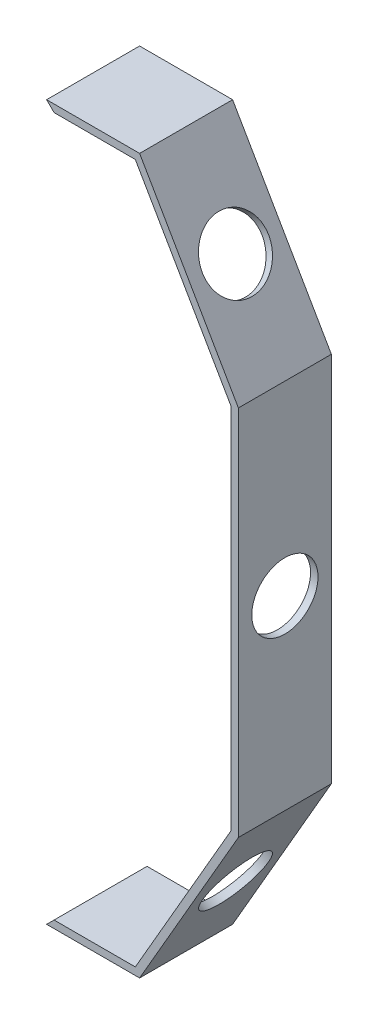
ISO-10303-21;
HEADER;
FILE_DESCRIPTION(('STEP AP214'),'2;1');
FILE_NAME('part.step','',(''),(''),'','','');
FILE_SCHEMA(('AUTOMOTIVE_DESIGN { 1 0 10303 214 1 1 1 1 }'));
ENDSEC;
DATA;
#1=APPLICATION_CONTEXT('core data for automotive mechanical design processes');
#2=APPLICATION_PROTOCOL_DEFINITION('international standard','automotive_design',2000,#1);
#3=PRODUCT_CONTEXT('',#1,'mechanical');
#4=PRODUCT('Part','Part','',(#3));
#5=PRODUCT_RELATED_PRODUCT_CATEGORY('part','',(#4));
#6=PRODUCT_DEFINITION_FORMATION('','',#4);
#7=PRODUCT_DEFINITION_CONTEXT('part definition',#1,'design');
#8=PRODUCT_DEFINITION('design','',#6,#7);
#9=PRODUCT_DEFINITION_SHAPE('','',#8);
#10=(LENGTH_UNIT() NAMED_UNIT(*) SI_UNIT(.MILLI.,.METRE.));
#11=(NAMED_UNIT(*) PLANE_ANGLE_UNIT() SI_UNIT($,.RADIAN.));
#12=(NAMED_UNIT(*) SI_UNIT($,.STERADIAN.) SOLID_ANGLE_UNIT());
#13=UNCERTAINTY_MEASURE_WITH_UNIT(LENGTH_MEASURE(1.E-05),#10,'distance_accuracy_value','');
#14=(GEOMETRIC_REPRESENTATION_CONTEXT(3) GLOBAL_UNCERTAINTY_ASSIGNED_CONTEXT((#13)) GLOBAL_UNIT_ASSIGNED_CONTEXT((#10,
#11,#12)) REPRESENTATION_CONTEXT('',''));
#15=CARTESIAN_POINT('',(0.,0.,0.));
#16=DIRECTION('',(0.,0.,1.));
#17=DIRECTION('',(1.,0.,0.));
#18=AXIS2_PLACEMENT_3D('',#15,#16,#17);
#19=CARTESIAN_POINT('',(-12.5,96.,25.));
#20=DIRECTION('',(0.,-1.,0.));
#21=DIRECTION('',(0.,0.,-1.));
#22=AXIS2_PLACEMENT_3D('',#19,#20,#21);
#23=PLANE('',#22);
#24=DIRECTION('',(-1.,0.,0.));
#25=VECTOR('',#24,1.);
#26=CARTESIAN_POINT('',(-12.5,96.,0.));
#27=LINE('',#26,#25);
#28=CARTESIAN_POINT('',(12.5,96.,0.));
#29=VERTEX_POINT('',#28);
#30=CARTESIAN_POINT('',(-12.5,96.,0.));
#31=VERTEX_POINT('',#30);
#32=EDGE_CURVE('E156',#29,#31,#27,.T.);
#33=ORIENTED_EDGE('',*,*,#32,.T.);
#34=DIRECTION('',(0.,0.,-1.));
#35=VECTOR('',#34,1.);
#36=CARTESIAN_POINT('',(-12.5,96.,25.));
#37=LINE('',#36,#35);
#38=CARTESIAN_POINT('',(-12.5,96.,25.));
#39=VERTEX_POINT('',#38);
#40=EDGE_CURVE('E11',#39,#31,#37,.T.);
#41=ORIENTED_EDGE('',*,*,#40,.F.);
#42=DIRECTION('',(-1.,0.,0.));
#43=VECTOR('',#42,1.);
#44=CARTESIAN_POINT('',(-12.5,96.,25.));
#45=LINE('',#44,#43);
#46=CARTESIAN_POINT('',(12.5,96.,25.));
#47=VERTEX_POINT('',#46);
#48=EDGE_CURVE('E179',#47,#39,#45,.T.);
#49=ORIENTED_EDGE('',*,*,#48,.F.);
#50=DIRECTION('',(0.,0.,-1.));
#51=VECTOR('',#50,1.);
#52=CARTESIAN_POINT('',(12.5,96.,25.));
#53=LINE('',#52,#51);
#54=EDGE_CURVE('E152',#47,#29,#53,.T.);
#55=ORIENTED_EDGE('',*,*,#54,.T.);
#56=EDGE_LOOP('',(#33,#41,#49,#55));
#57=FACE_BOUND('',#56,.T.);
#58=ADVANCED_FACE('F36',(#57),#23,.F.);
#59=CARTESIAN_POINT('',(-12.5,96.,25.));
#60=DIRECTION('',(0.707106781186548,0.707106781186547,0.));
#61=DIRECTION('',(-0.707106781186547,0.707106781186548,0.));
#62=AXIS2_PLACEMENT_3D('',#59,#60,#61);
#63=PLANE('',#62);
#64=DIRECTION('',(0.707106781186547,-0.707106781186548,0.));
#65=VECTOR('',#64,1.);
#66=CARTESIAN_POINT('',(-12.5,96.,0.));
#67=LINE('',#66,#65);
#68=CARTESIAN_POINT('',(-10.5,94.,0.));
#69=VERTEX_POINT('',#68);
#70=EDGE_CURVE('E159',#31,#69,#67,.T.);
#71=ORIENTED_EDGE('',*,*,#70,.T.);
#72=DIRECTION('',(0.,0.,-1.));
#73=VECTOR('',#72,1.);
#74=CARTESIAN_POINT('',(-10.5,94.,25.));
#75=LINE('',#74,#73);
#76=CARTESIAN_POINT('',(-10.5,94.,25.));
#77=VERTEX_POINT('',#76);
#78=EDGE_CURVE('E44',#77,#69,#75,.T.);
#79=ORIENTED_EDGE('',*,*,#78,.F.);
#80=DIRECTION('',(0.707106781186547,-0.707106781186548,0.));
#81=VECTOR('',#80,1.);
#82=CARTESIAN_POINT('',(-12.5,96.,25.));
#83=LINE('',#82,#81);
#84=EDGE_CURVE('E107',#39,#77,#83,.T.);
#85=ORIENTED_EDGE('',*,*,#84,.F.);
#86=ORIENTED_EDGE('',*,*,#40,.T.);
#87=EDGE_LOOP('',(#71,#79,#85,#86));
#88=FACE_BOUND('',#87,.T.);
#89=ADVANCED_FACE('F260',(#88),#63,.F.);
#90=CARTESIAN_POINT('',(-10.5,94.,25.));
#91=DIRECTION('',(0.,1.,0.));
#92=DIRECTION('',(0.,0.,1.));
#93=AXIS2_PLACEMENT_3D('',#90,#91,#92);
#94=PLANE('',#93);
#95=DIRECTION('',(1.,0.,0.));
#96=VECTOR('',#95,1.);
#97=CARTESIAN_POINT('',(-10.5,94.,0.));
#98=LINE('',#97,#96);
#99=CARTESIAN_POINT('',(11.3452994616208,94.,0.));
#100=VERTEX_POINT('',#99);
#101=EDGE_CURVE('E162',#69,#100,#98,.T.);
#102=ORIENTED_EDGE('',*,*,#101,.T.);
#103=DIRECTION('',(0.,0.,-1.));
#104=VECTOR('',#103,1.);
#105=CARTESIAN_POINT('',(11.3452994616208,94.,25.));
#106=LINE('',#105,#104);
#107=CARTESIAN_POINT('',(11.3452994616208,94.,25.));
#108=VERTEX_POINT('',#107);
#109=EDGE_CURVE('E198',#108,#100,#106,.T.);
#110=ORIENTED_EDGE('',*,*,#109,.F.);
#111=DIRECTION('',(1.,0.,0.));
#112=VECTOR('',#111,1.);
#113=CARTESIAN_POINT('',(-10.5,94.,25.));
#114=LINE('',#113,#112);
#115=EDGE_CURVE('E206',#77,#108,#114,.T.);
#116=ORIENTED_EDGE('',*,*,#115,.F.);
#117=ORIENTED_EDGE('',*,*,#78,.T.);
#118=EDGE_LOOP('',(#102,#110,#116,#117));
#119=FACE_BOUND('',#118,.T.);
#120=ADVANCED_FACE('F204',(#119),#94,.F.);
#121=CARTESIAN_POINT('',(11.3452994616208,94.,25.));
#122=DIRECTION('',(0.866025403784435,0.500000000000007,0.));
#123=DIRECTION('',(-0.500000000000007,0.866025403784435,0.));
#124=AXIS2_PLACEMENT_3D('',#121,#122,#123);
#125=PLANE('',#124);
#126=CARTESIAN_POINT('',(24.0470053837928,72.,12.5));
#127=DIRECTION('',(0.866025403784435,0.500000000000007,0.));
#128=DIRECTION('',(-0.500000000000007,0.866025403784435,0.));
#129=AXIS2_PLACEMENT_3D('',#126,#127,#128);
#130=CIRCLE('',#129,8.9);
#131=CARTESIAN_POINT('',(19.5970053837927,79.7076260936815,12.5));
#132=VERTEX_POINT('',#131);
#133=EDGE_CURVE('E303',#132,#132,#130,.T.);
#134=ORIENTED_EDGE('',*,*,#133,.T.);
#135=EDGE_LOOP('',(#134));
#136=FACE_BOUND('',#135,.T.);
#137=DIRECTION('',(0.500000000000007,-0.866025403784435,0.));
#138=VECTOR('',#137,1.);
#139=CARTESIAN_POINT('',(11.3452994616208,94.,0.));
#140=LINE('',#139,#138);
#141=CARTESIAN_POINT('',(37.0581123827233,49.4641016151377,0.));
#142=VERTEX_POINT('',#141);
#143=EDGE_CURVE('E164',#100,#142,#140,.T.);
#144=ORIENTED_EDGE('',*,*,#143,.T.);
#145=DIRECTION('',(0.,0.,-1.));
#146=VECTOR('',#145,1.);
#147=CARTESIAN_POINT('',(37.0581123827233,49.4641016151377,25.));
#148=LINE('',#147,#146);
#149=CARTESIAN_POINT('',(37.0581123827233,49.4641016151377,25.));
#150=VERTEX_POINT('',#149);
#151=EDGE_CURVE('E195',#150,#142,#148,.T.);
#152=ORIENTED_EDGE('',*,*,#151,.F.);
#153=DIRECTION('',(0.500000000000007,-0.866025403784435,0.));
#154=VECTOR('',#153,1.);
#155=CARTESIAN_POINT('',(11.3452994616208,94.,25.));
#156=LINE('',#155,#154);
#157=EDGE_CURVE('E224',#108,#150,#156,.T.);
#158=ORIENTED_EDGE('',*,*,#157,.F.);
#159=ORIENTED_EDGE('',*,*,#109,.T.);
#160=EDGE_LOOP('',(#144,#152,#158,#159));
#161=FACE_BOUND('',#160,.T.);
#162=ADVANCED_FACE('F215',(#136,#161),#125,.F.);
#163=CARTESIAN_POINT('',(37.0581123827233,-49.4641016151378,25.));
#164=DIRECTION('',(1.,0.,0.));
#165=DIRECTION('',(0.,0.,-1.));
#166=AXIS2_PLACEMENT_3D('',#163,#164,#165);
#167=PLANE('',#166);
#168=CARTESIAN_POINT('',(37.0581123827233,0.,12.5));
#169=DIRECTION('',(1.,0.,0.));
#170=DIRECTION('',(0.,0.,-1.));
#171=AXIS2_PLACEMENT_3D('',#168,#169,#170);
#172=CIRCLE('',#171,8.9);
#173=CARTESIAN_POINT('',(37.0581123827233,0.,3.6));
#174=VERTEX_POINT('',#173);
#175=EDGE_CURVE('E160',#174,#174,#172,.T.);
#176=ORIENTED_EDGE('',*,*,#175,.T.);
#177=EDGE_LOOP('',(#176));
#178=FACE_BOUND('',#177,.T.);
#179=DIRECTION('',(0.,-1.,0.));
#180=VECTOR('',#179,1.);
#181=CARTESIAN_POINT('',(37.0581123827233,-49.4641016151378,0.));
#182=LINE('',#181,#180);
#183=CARTESIAN_POINT('',(37.0581123827233,-49.4641016151378,0.));
#184=VERTEX_POINT('',#183);
#185=EDGE_CURVE('E166',#142,#184,#182,.T.);
#186=ORIENTED_EDGE('',*,*,#185,.T.);
#187=DIRECTION('',(0.,0.,-1.));
#188=VECTOR('',#187,1.);
#189=CARTESIAN_POINT('',(37.0581123827233,-49.4641016151378,25.));
#190=LINE('',#189,#188);
#191=CARTESIAN_POINT('',(37.0581123827233,-49.4641016151378,25.));
#192=VERTEX_POINT('',#191);
#193=EDGE_CURVE('E192',#192,#184,#190,.T.);
#194=ORIENTED_EDGE('',*,*,#193,.F.);
#195=DIRECTION('',(0.,-1.,0.));
#196=VECTOR('',#195,1.);
#197=CARTESIAN_POINT('',(37.0581123827233,-49.4641016151378,25.));
#198=LINE('',#197,#196);
#199=EDGE_CURVE('E221',#150,#192,#198,.T.);
#200=ORIENTED_EDGE('',*,*,#199,.F.);
#201=ORIENTED_EDGE('',*,*,#151,.T.);
#202=EDGE_LOOP('',(#186,#194,#200,#201));
#203=FACE_BOUND('',#202,.T.);
#204=ADVANCED_FACE('F219',(#178,#203),#167,.F.);
#205=CARTESIAN_POINT('',(37.0581123827233,-49.4641016151378,25.));
#206=DIRECTION('',(0.866025403784435,-0.500000000000007,0.));
#207=DIRECTION('',(0.500000000000007,0.866025403784435,0.));
#208=AXIS2_PLACEMENT_3D('',#205,#206,#207);
#209=PLANE('',#208);
#210=CARTESIAN_POINT('',(24.0470053837928,-72.,12.5));
#211=DIRECTION('',(0.866025403784435,-0.500000000000007,0.));
#212=DIRECTION('',(0.500000000000007,0.866025403784435,0.));
#213=AXIS2_PLACEMENT_3D('',#210,#211,#212);
#214=CIRCLE('',#213,8.9);
#215=CARTESIAN_POINT('',(28.4970053837928,-64.2923739063185,12.5));
#216=VERTEX_POINT('',#215);
#217=EDGE_CURVE('E295',#216,#216,#214,.T.);
#218=ORIENTED_EDGE('',*,*,#217,.T.);
#219=EDGE_LOOP('',(#218));
#220=FACE_BOUND('',#219,.T.);
#221=DIRECTION('',(-0.500000000000007,-0.866025403784435,0.));
#222=VECTOR('',#221,1.);
#223=CARTESIAN_POINT('',(37.0581123827233,-49.4641016151378,0.));
#224=LINE('',#223,#222);
#225=CARTESIAN_POINT('',(11.3452994616208,-94.,0.));
#226=VERTEX_POINT('',#225);
#227=EDGE_CURVE('E168',#184,#226,#224,.T.);
#228=ORIENTED_EDGE('',*,*,#227,.T.);
#229=DIRECTION('',(0.,0.,-1.));
#230=VECTOR('',#229,1.);
#231=CARTESIAN_POINT('',(11.3452994616208,-94.,25.));
#232=LINE('',#231,#230);
#233=CARTESIAN_POINT('',(11.3452994616208,-94.,25.));
#234=VERTEX_POINT('',#233);
#235=EDGE_CURVE('E189',#234,#226,#232,.T.);
#236=ORIENTED_EDGE('',*,*,#235,.F.);
#237=DIRECTION('',(-0.500000000000007,-0.866025403784435,0.));
#238=VECTOR('',#237,1.);
#239=CARTESIAN_POINT('',(37.0581123827233,-49.4641016151378,25.));
#240=LINE('',#239,#238);
#241=EDGE_CURVE('E223',#192,#234,#240,.T.);
#242=ORIENTED_EDGE('',*,*,#241,.F.);
#243=ORIENTED_EDGE('',*,*,#193,.T.);
#244=EDGE_LOOP('',(#228,#236,#242,#243));
#245=FACE_BOUND('',#244,.T.);
#246=ADVANCED_FACE('F274',(#220,#245),#209,.F.);
#247=CARTESIAN_POINT('',(-10.5,-94.,25.));
#248=DIRECTION('',(0.,-1.,0.));
#249=DIRECTION('',(0.,0.,-1.));
#250=AXIS2_PLACEMENT_3D('',#247,#248,#249);
#251=PLANE('',#250);
#252=DIRECTION('',(-1.,0.,0.));
#253=VECTOR('',#252,1.);
#254=CARTESIAN_POINT('',(-10.5,-94.,0.));
#255=LINE('',#254,#253);
#256=CARTESIAN_POINT('',(-10.5,-94.,0.));
#257=VERTEX_POINT('',#256);
#258=EDGE_CURVE('E170',#226,#257,#255,.T.);
#259=ORIENTED_EDGE('',*,*,#258,.T.);
#260=DIRECTION('',(0.,0.,-1.));
#261=VECTOR('',#260,1.);
#262=CARTESIAN_POINT('',(-10.5,-94.,25.));
#263=LINE('',#262,#261);
#264=CARTESIAN_POINT('',(-10.5,-94.,25.));
#265=VERTEX_POINT('',#264);
#266=EDGE_CURVE('E186',#265,#257,#263,.T.);
#267=ORIENTED_EDGE('',*,*,#266,.F.);
#268=DIRECTION('',(-1.,0.,0.));
#269=VECTOR('',#268,1.);
#270=CARTESIAN_POINT('',(-10.5,-94.,25.));
#271=LINE('',#270,#269);
#272=EDGE_CURVE('E226',#234,#265,#271,.T.);
#273=ORIENTED_EDGE('',*,*,#272,.F.);
#274=ORIENTED_EDGE('',*,*,#235,.T.);
#275=EDGE_LOOP('',(#259,#267,#273,#274));
#276=FACE_BOUND('',#275,.T.);
#277=ADVANCED_FACE('F278',(#276),#251,.F.);
#278=CARTESIAN_POINT('',(-10.5,-94.,25.));
#279=DIRECTION('',(0.707106781186548,-0.707106781186547,0.));
#280=DIRECTION('',(0.707106781186547,0.707106781186548,0.));
#281=AXIS2_PLACEMENT_3D('',#278,#279,#280);
#282=PLANE('',#281);
#283=DIRECTION('',(-0.707106781186547,-0.707106781186548,0.));
#284=VECTOR('',#283,1.);
#285=CARTESIAN_POINT('',(-10.5,-94.,0.));
#286=LINE('',#285,#284);
#287=CARTESIAN_POINT('',(-12.5,-96.,0.));
#288=VERTEX_POINT('',#287);
#289=EDGE_CURVE('E172',#257,#288,#286,.T.);
#290=ORIENTED_EDGE('',*,*,#289,.T.);
#291=DIRECTION('',(0.,0.,-1.));
#292=VECTOR('',#291,1.);
#293=CARTESIAN_POINT('',(-12.5,-96.,25.));
#294=LINE('',#293,#292);
#295=CARTESIAN_POINT('',(-12.5,-96.,25.));
#296=VERTEX_POINT('',#295);
#297=EDGE_CURVE('E183',#296,#288,#294,.T.);
#298=ORIENTED_EDGE('',*,*,#297,.F.);
#299=DIRECTION('',(-0.707106781186547,-0.707106781186548,0.));
#300=VECTOR('',#299,1.);
#301=CARTESIAN_POINT('',(-10.5,-94.,25.));
#302=LINE('',#301,#300);
#303=EDGE_CURVE('E232',#265,#296,#302,.T.);
#304=ORIENTED_EDGE('',*,*,#303,.F.);
#305=ORIENTED_EDGE('',*,*,#266,.T.);
#306=EDGE_LOOP('',(#290,#298,#304,#305));
#307=FACE_BOUND('',#306,.T.);
#308=ADVANCED_FACE('F238',(#307),#282,.F.);
#309=CARTESIAN_POINT('',(-12.5,-96.,25.));
#310=DIRECTION('',(0.,1.,0.));
#311=DIRECTION('',(0.,0.,1.));
#312=AXIS2_PLACEMENT_3D('',#309,#310,#311);
#313=PLANE('',#312);
#314=DIRECTION('',(1.,0.,0.));
#315=VECTOR('',#314,1.);
#316=CARTESIAN_POINT('',(-12.5,-96.,0.));
#317=LINE('',#316,#315);
#318=CARTESIAN_POINT('',(12.5,-96.,0.));
#319=VERTEX_POINT('',#318);
#320=EDGE_CURVE('E174',#288,#319,#317,.T.);
#321=ORIENTED_EDGE('',*,*,#320,.T.);
#322=DIRECTION('',(0.,0.,-1.));
#323=VECTOR('',#322,1.);
#324=CARTESIAN_POINT('',(12.5,-96.,25.));
#325=LINE('',#324,#323);
#326=CARTESIAN_POINT('',(12.5,-96.,25.));
#327=VERTEX_POINT('',#326);
#328=EDGE_CURVE('E147',#327,#319,#325,.T.);
#329=ORIENTED_EDGE('',*,*,#328,.F.);
#330=DIRECTION('',(1.,0.,0.));
#331=VECTOR('',#330,1.);
#332=CARTESIAN_POINT('',(-12.5,-96.,25.));
#333=LINE('',#332,#331);
#334=EDGE_CURVE('E138',#296,#327,#333,.T.);
#335=ORIENTED_EDGE('',*,*,#334,.F.);
#336=ORIENTED_EDGE('',*,*,#297,.T.);
#337=EDGE_LOOP('',(#321,#329,#335,#336));
#338=FACE_BOUND('',#337,.T.);
#339=ADVANCED_FACE('F242',(#338),#313,.F.);
#340=CARTESIAN_POINT('',(39.0581123827233,-50.,25.));
#341=DIRECTION('',(-0.866025403784435,0.500000000000007,0.));
#342=DIRECTION('',(-0.500000000000007,-0.866025403784435,0.));
#343=AXIS2_PLACEMENT_3D('',#340,#341,#342);
#344=PLANE('',#343);
#345=CARTESIAN_POINT('',(25.7790561913616,-73.,12.5));
#346=DIRECTION('',(0.866025403784435,-0.500000000000007,0.));
#347=DIRECTION('',(0.500000000000007,0.866025403784435,0.));
#348=AXIS2_PLACEMENT_3D('',#345,#346,#347);
#349=CIRCLE('',#348,8.9);
#350=CARTESIAN_POINT('',(30.2290561913617,-65.2923739063185,12.5));
#351=VERTEX_POINT('',#350);
#352=EDGE_CURVE('E293',#351,#351,#349,.T.);
#353=ORIENTED_EDGE('',*,*,#352,.F.);
#354=EDGE_LOOP('',(#353));
#355=FACE_BOUND('',#354,.T.);
#356=DIRECTION('',(0.500000000000007,0.866025403784435,0.));
#357=VECTOR('',#356,1.);
#358=CARTESIAN_POINT('',(39.0581123827233,-50.,0.));
#359=LINE('',#358,#357);
#360=CARTESIAN_POINT('',(39.0581123827233,-50.,0.));
#361=VERTEX_POINT('',#360);
#362=EDGE_CURVE('E146',#319,#361,#359,.T.);
#363=ORIENTED_EDGE('',*,*,#362,.T.);
#364=DIRECTION('',(0.,0.,-1.));
#365=VECTOR('',#364,1.);
#366=CARTESIAN_POINT('',(39.0581123827233,-50.,25.));
#367=LINE('',#366,#365);
#368=CARTESIAN_POINT('',(39.0581123827233,-50.,25.));
#369=VERTEX_POINT('',#368);
#370=EDGE_CURVE('E143',#369,#361,#367,.T.);
#371=ORIENTED_EDGE('',*,*,#370,.F.);
#372=DIRECTION('',(0.500000000000007,0.866025403784435,0.));
#373=VECTOR('',#372,1.);
#374=CARTESIAN_POINT('',(39.0581123827233,-50.,25.));
#375=LINE('',#374,#373);
#376=EDGE_CURVE('E132',#327,#369,#375,.T.);
#377=ORIENTED_EDGE('',*,*,#376,.F.);
#378=ORIENTED_EDGE('',*,*,#328,.T.);
#379=EDGE_LOOP('',(#363,#371,#377,#378));
#380=FACE_BOUND('',#379,.T.);
#381=ADVANCED_FACE('F144',(#355,#380),#344,.F.);
#382=CARTESIAN_POINT('',(39.0581123827233,-50.,25.));
#383=DIRECTION('',(-1.,0.,0.));
#384=DIRECTION('',(0.,0.,1.));
#385=AXIS2_PLACEMENT_3D('',#382,#383,#384);
#386=PLANE('',#385);
#387=CARTESIAN_POINT('',(39.0581123827233,0.,12.5));
#388=DIRECTION('',(1.,0.,0.));
#389=DIRECTION('',(0.,0.,-1.));
#390=AXIS2_PLACEMENT_3D('',#387,#388,#389);
#391=CIRCLE('',#390,8.9);
#392=CARTESIAN_POINT('',(39.0581123827233,0.,3.6));
#393=VERTEX_POINT('',#392);
#394=EDGE_CURVE('E306',#393,#393,#391,.T.);
#395=ORIENTED_EDGE('',*,*,#394,.F.);
#396=EDGE_LOOP('',(#395));
#397=FACE_BOUND('',#396,.T.);
#398=DIRECTION('',(0.,1.,0.));
#399=VECTOR('',#398,1.);
#400=CARTESIAN_POINT('',(39.0581123827233,-50.,0.));
#401=LINE('',#400,#399);
#402=CARTESIAN_POINT('',(39.0581123827233,50.,0.));
#403=VERTEX_POINT('',#402);
#404=EDGE_CURVE('E93',#361,#403,#401,.T.);
#405=ORIENTED_EDGE('',*,*,#404,.T.);
#406=DIRECTION('',(0.,0.,-1.));
#407=VECTOR('',#406,1.);
#408=CARTESIAN_POINT('',(39.0581123827233,50.,25.));
#409=LINE('',#408,#407);
#410=CARTESIAN_POINT('',(39.0581123827233,50.,25.));
#411=VERTEX_POINT('',#410);
#412=EDGE_CURVE('E148',#411,#403,#409,.T.);
#413=ORIENTED_EDGE('',*,*,#412,.F.);
#414=DIRECTION('',(0.,1.,0.));
#415=VECTOR('',#414,1.);
#416=CARTESIAN_POINT('',(39.0581123827233,-50.,25.));
#417=LINE('',#416,#415);
#418=EDGE_CURVE('E136',#369,#411,#417,.T.);
#419=ORIENTED_EDGE('',*,*,#418,.F.);
#420=ORIENTED_EDGE('',*,*,#370,.T.);
#421=EDGE_LOOP('',(#405,#413,#419,#420));
#422=FACE_BOUND('',#421,.T.);
#423=ADVANCED_FACE('F150',(#397,#422),#386,.F.);
#424=CARTESIAN_POINT('',(12.5,96.,25.));
#425=DIRECTION('',(-0.866025403784435,-0.500000000000007,0.));
#426=DIRECTION('',(0.500000000000007,-0.866025403784435,0.));
#427=AXIS2_PLACEMENT_3D('',#424,#425,#426);
#428=PLANE('',#427);
#429=CARTESIAN_POINT('',(25.7790561913616,73.,12.5));
#430=DIRECTION('',(0.866025403784435,0.500000000000007,0.));
#431=DIRECTION('',(-0.500000000000007,0.866025403784435,0.));
#432=AXIS2_PLACEMENT_3D('',#429,#430,#431);
#433=CIRCLE('',#432,8.9);
#434=CARTESIAN_POINT('',(21.3290561913616,80.7076260936815,12.5));
#435=VERTEX_POINT('',#434);
#436=EDGE_CURVE('E298',#435,#435,#433,.T.);
#437=ORIENTED_EDGE('',*,*,#436,.F.);
#438=EDGE_LOOP('',(#437));
#439=FACE_BOUND('',#438,.T.);
#440=DIRECTION('',(-0.500000000000007,0.866025403784435,0.));
#441=VECTOR('',#440,1.);
#442=CARTESIAN_POINT('',(12.5,96.,0.));
#443=LINE('',#442,#441);
#444=EDGE_CURVE('E99',#403,#29,#443,.T.);
#445=ORIENTED_EDGE('',*,*,#444,.T.);
#446=ORIENTED_EDGE('',*,*,#54,.F.);
#447=DIRECTION('',(-0.500000000000007,0.866025403784435,0.));
#448=VECTOR('',#447,1.);
#449=CARTESIAN_POINT('',(12.5,96.,25.));
#450=LINE('',#449,#448);
#451=EDGE_CURVE('E52',#411,#47,#450,.T.);
#452=ORIENTED_EDGE('',*,*,#451,.F.);
#453=ORIENTED_EDGE('',*,*,#412,.T.);
#454=EDGE_LOOP('',(#445,#446,#452,#453));
#455=FACE_BOUND('',#454,.T.);
#456=ADVANCED_FACE('F246',(#439,#455),#428,.F.);
#457=CARTESIAN_POINT('',(0.,0.,25.));
#458=DIRECTION('',(0.,0.,1.));
#459=DIRECTION('',(1.,0.,0.));
#460=AXIS2_PLACEMENT_3D('',#457,#458,#459);
#461=PLANE('',#460);
#462=ORIENTED_EDGE('',*,*,#48,.T.);
#463=ORIENTED_EDGE('',*,*,#84,.T.);
#464=ORIENTED_EDGE('',*,*,#115,.T.);
#465=ORIENTED_EDGE('',*,*,#157,.T.);
#466=ORIENTED_EDGE('',*,*,#199,.T.);
#467=ORIENTED_EDGE('',*,*,#241,.T.);
#468=ORIENTED_EDGE('',*,*,#272,.T.);
#469=ORIENTED_EDGE('',*,*,#303,.T.);
#470=ORIENTED_EDGE('',*,*,#334,.T.);
#471=ORIENTED_EDGE('',*,*,#376,.T.);
#472=ORIENTED_EDGE('',*,*,#418,.T.);
#473=ORIENTED_EDGE('',*,*,#451,.T.);
#474=EDGE_LOOP('',(#462,#463,#464,#465,#466,#467,#468,#469,#470,#471,#472,#473));
#475=FACE_BOUND('',#474,.T.);
#476=ADVANCED_FACE('F134',(#475),#461,.T.);
#477=CARTESIAN_POINT('',(0.,0.,0.));
#478=DIRECTION('',(0.,0.,1.));
#479=DIRECTION('',(1.,0.,0.));
#480=AXIS2_PLACEMENT_3D('',#477,#478,#479);
#481=PLANE('',#480);
#482=ORIENTED_EDGE('',*,*,#32,.F.);
#483=ORIENTED_EDGE('',*,*,#444,.F.);
#484=ORIENTED_EDGE('',*,*,#404,.F.);
#485=ORIENTED_EDGE('',*,*,#362,.F.);
#486=ORIENTED_EDGE('',*,*,#320,.F.);
#487=ORIENTED_EDGE('',*,*,#289,.F.);
#488=ORIENTED_EDGE('',*,*,#258,.F.);
#489=ORIENTED_EDGE('',*,*,#227,.F.);
#490=ORIENTED_EDGE('',*,*,#185,.F.);
#491=ORIENTED_EDGE('',*,*,#143,.F.);
#492=ORIENTED_EDGE('',*,*,#101,.F.);
#493=ORIENTED_EDGE('',*,*,#70,.F.);
#494=EDGE_LOOP('',(#482,#483,#484,#485,#486,#487,#488,#489,#490,#491,#492,#493));
#495=FACE_BOUND('',#494,.T.);
#496=ADVANCED_FACE('F210',(#495),#481,.F.);
#497=CARTESIAN_POINT('',(14.0581123827233,0.,12.5));
#498=DIRECTION('',(1.,0.,0.));
#499=DIRECTION('',(0.,0.,-1.));
#500=AXIS2_PLACEMENT_3D('',#497,#498,#499);
#501=CYLINDRICAL_SURFACE('',#500,8.9);
#502=ORIENTED_EDGE('',*,*,#394,.T.);
#503=EDGE_LOOP('',(#502));
#504=FACE_BOUND('',#503,.T.);
#505=ORIENTED_EDGE('',*,*,#175,.F.);
#506=EDGE_LOOP('',(#505));
#507=FACE_BOUND('',#506,.T.);
#508=ADVANCED_FACE('F314',(#504,#507),#501,.F.);
#509=CARTESIAN_POINT('',(4.12842109675076,60.4999999999998,12.5));
#510=DIRECTION('',(0.866025403784435,0.500000000000007,0.));
#511=DIRECTION('',(-0.500000000000007,0.866025403784435,0.));
#512=AXIS2_PLACEMENT_3D('',#509,#510,#511);
#513=CYLINDRICAL_SURFACE('',#512,8.9);
#514=ORIENTED_EDGE('',*,*,#436,.T.);
#515=EDGE_LOOP('',(#514));
#516=FACE_BOUND('',#515,.T.);
#517=ORIENTED_EDGE('',*,*,#133,.F.);
#518=EDGE_LOOP('',(#517));
#519=FACE_BOUND('',#518,.T.);
#520=ADVANCED_FACE('F316',(#516,#519),#513,.F.);
#521=CARTESIAN_POINT('',(4.12842109675076,-60.4999999999998,12.5));
#522=DIRECTION('',(0.866025403784435,-0.500000000000007,0.));
#523=DIRECTION('',(0.500000000000007,0.866025403784435,0.));
#524=AXIS2_PLACEMENT_3D('',#521,#522,#523);
#525=CYLINDRICAL_SURFACE('',#524,8.9);
#526=ORIENTED_EDGE('',*,*,#352,.T.);
#527=EDGE_LOOP('',(#526));
#528=FACE_BOUND('',#527,.T.);
#529=ORIENTED_EDGE('',*,*,#217,.F.);
#530=EDGE_LOOP('',(#529));
#531=FACE_BOUND('',#530,.T.);
#532=ADVANCED_FACE('F323',(#528,#531),#525,.F.);
#533=CLOSED_SHELL('',(#58,#89,#120,#162,#204,#246,#277,#308,#339,#381,#423,#456,#476,#496,#508,
#520,#532));
#534=MANIFOLD_SOLID_BREP('B2',#533);
#535=ADVANCED_BREP_SHAPE_REPRESENTATION('',(#18,#534),#14);
#536=SHAPE_DEFINITION_REPRESENTATION(#9,#535);
ENDSEC;
END-ISO-10303-21;
